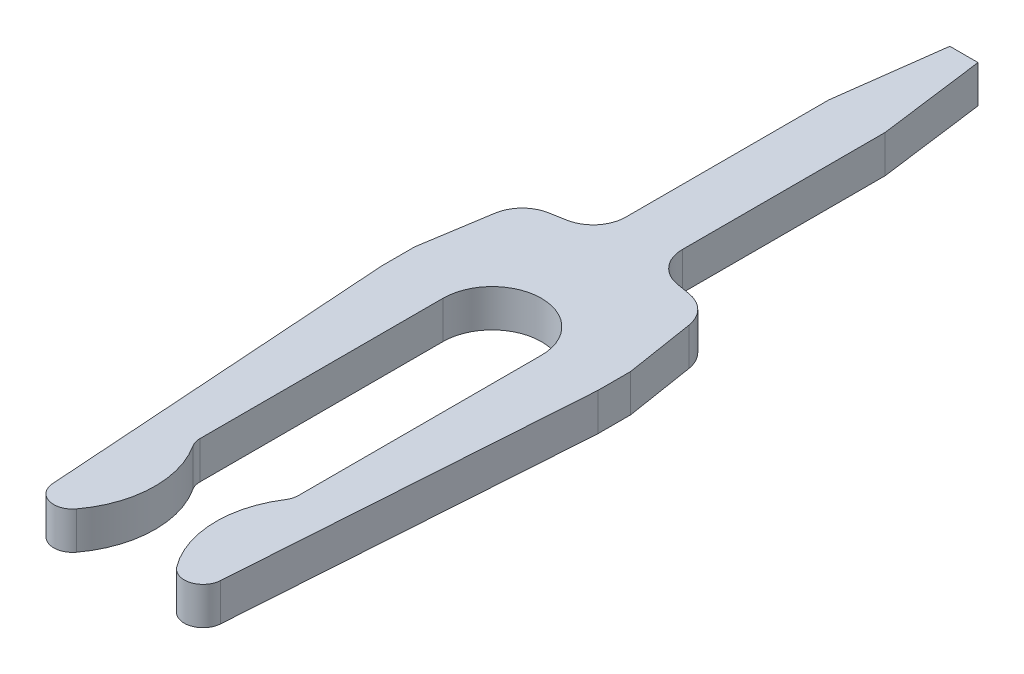
ISO-10303-21;
HEADER;
FILE_DESCRIPTION(('STEP AP214'),'2;1');
FILE_NAME('part.step','',(''),(''),'','','');
FILE_SCHEMA(('AUTOMOTIVE_DESIGN { 1 0 10303 214 1 1 1 1 }'));
ENDSEC;
DATA;
#1=APPLICATION_CONTEXT('core data for automotive mechanical design processes');
#2=APPLICATION_PROTOCOL_DEFINITION('international standard','automotive_design',2000,#1);
#3=PRODUCT_CONTEXT('',#1,'mechanical');
#4=PRODUCT('Part','Part','',(#3));
#5=PRODUCT_RELATED_PRODUCT_CATEGORY('part','',(#4));
#6=PRODUCT_DEFINITION_FORMATION('','',#4);
#7=PRODUCT_DEFINITION_CONTEXT('part definition',#1,'design');
#8=PRODUCT_DEFINITION('design','',#6,#7);
#9=PRODUCT_DEFINITION_SHAPE('','',#8);
#10=(LENGTH_UNIT() NAMED_UNIT(*) SI_UNIT(.MILLI.,.METRE.));
#11=(NAMED_UNIT(*) PLANE_ANGLE_UNIT() SI_UNIT($,.RADIAN.));
#12=(NAMED_UNIT(*) SI_UNIT($,.STERADIAN.) SOLID_ANGLE_UNIT());
#13=UNCERTAINTY_MEASURE_WITH_UNIT(LENGTH_MEASURE(1.E-05),#10,'distance_accuracy_value','');
#14=(GEOMETRIC_REPRESENTATION_CONTEXT(3) GLOBAL_UNCERTAINTY_ASSIGNED_CONTEXT((#13)) GLOBAL_UNIT_ASSIGNED_CONTEXT((#10,
#11,#12)) REPRESENTATION_CONTEXT('',''));
#15=CARTESIAN_POINT('',(0.,0.,0.));
#16=DIRECTION('',(0.,0.,1.));
#17=DIRECTION('',(1.,0.,0.));
#18=AXIS2_PLACEMENT_3D('',#15,#16,#17);
#19=CARTESIAN_POINT('',(1.85247354946435,-0.2,1.01741555409719));
#20=DIRECTION('',(0.,1.,0.));
#21=DIRECTION('',(-0.173648177666931,0.,-0.984807753012208));
#22=AXIS2_PLACEMENT_3D('',#19,#20,#21);
#23=CYLINDRICAL_SURFACE('',#22,0.35);
#24=CARTESIAN_POINT('',(1.85247354946435,-0.2,1.01741555409719));
#25=DIRECTION('',(0.,1.,0.));
#26=DIRECTION('',(-0.173648177666931,0.,-0.984807753012208));
#27=AXIS2_PLACEMENT_3D('',#24,#25,#26);
#28=CIRCLE('',#27,0.35);
#29=CARTESIAN_POINT('',(1.79169668728093,-0.2,0.672732840542913));
#30=VERTEX_POINT('',#29);
#31=CARTESIAN_POINT('',(1.50678263025605,-0.2,0.962663491333105));
#32=VERTEX_POINT('',#31);
#33=EDGE_CURVE('E11',#30,#32,#28,.T.);
#34=ORIENTED_EDGE('',*,*,#33,.T.);
#35=DIRECTION('',(0.,1.,0.));
#36=VECTOR('',#35,1.);
#37=CARTESIAN_POINT('',(1.50678263025605,-0.2,0.962663491333105));
#38=LINE('',#37,#36);
#39=CARTESIAN_POINT('',(1.50678263025605,0.2,0.962663491333105));
#40=VERTEX_POINT('',#39);
#41=EDGE_CURVE('E24',#32,#40,#38,.T.);
#42=ORIENTED_EDGE('',*,*,#41,.T.);
#43=CARTESIAN_POINT('',(1.85247354946435,0.2,1.01741555409719));
#44=DIRECTION('',(0.,1.,0.));
#45=DIRECTION('',(-0.173648177666931,0.,-0.984807753012208));
#46=AXIS2_PLACEMENT_3D('',#43,#44,#45);
#47=CIRCLE('',#46,0.35);
#48=CARTESIAN_POINT('',(1.79169668728093,0.2,0.672732840542913));
#49=VERTEX_POINT('',#48);
#50=EDGE_CURVE('E378',#49,#40,#47,.T.);
#51=ORIENTED_EDGE('',*,*,#50,.F.);
#52=DIRECTION('',(0.,1.,0.));
#53=VECTOR('',#52,1.);
#54=CARTESIAN_POINT('',(1.79169668728093,-0.2,0.672732840542913));
#55=LINE('',#54,#53);
#56=EDGE_CURVE('E210',#30,#49,#55,.T.);
#57=ORIENTED_EDGE('',*,*,#56,.F.);
#58=EDGE_LOOP('',(#34,#42,#51,#57));
#59=FACE_BOUND('',#58,.T.);
#60=ADVANCED_FACE('F17',(#59),#23,.T.);
#61=CARTESIAN_POINT('',(1.50678263025605,-0.2,0.962663491333105));
#62=DIRECTION('',(-0.987688340595138,0.,-0.156434465040231));
#63=DIRECTION('',(-0.156434465040231,0.,0.987688340595138));
#64=AXIS2_PLACEMENT_3D('',#61,#62,#63);
#65=PLANE('',#64);
#66=DIRECTION('',(-0.156434465040231,0.,0.987688340595138));
#67=VECTOR('',#66,1.);
#68=CARTESIAN_POINT('',(1.50678263025605,-0.2,0.962663491333105));
#69=LINE('',#68,#67);
#70=CARTESIAN_POINT('',(1.39,-0.2,1.7));
#71=VERTEX_POINT('',#70);
#72=EDGE_CURVE('E375',#32,#71,#69,.T.);
#73=ORIENTED_EDGE('',*,*,#72,.T.);
#74=DIRECTION('',(0.,1.,0.));
#75=VECTOR('',#74,1.);
#76=CARTESIAN_POINT('',(1.39,-0.2,1.7));
#77=LINE('',#76,#75);
#78=CARTESIAN_POINT('',(1.39,0.2,1.7));
#79=VERTEX_POINT('',#78);
#80=EDGE_CURVE('E373',#71,#79,#77,.T.);
#81=ORIENTED_EDGE('',*,*,#80,.T.);
#82=DIRECTION('',(-0.156434465040231,0.,0.987688340595138));
#83=VECTOR('',#82,1.);
#84=CARTESIAN_POINT('',(1.50678263025605,0.2,0.962663491333105));
#85=LINE('',#84,#83);
#86=EDGE_CURVE('E370',#40,#79,#85,.T.);
#87=ORIENTED_EDGE('',*,*,#86,.F.);
#88=ORIENTED_EDGE('',*,*,#41,.F.);
#89=EDGE_LOOP('',(#73,#81,#87,#88));
#90=FACE_BOUND('',#89,.T.);
#91=ADVANCED_FACE('F382',(#90),#65,.T.);
#92=CARTESIAN_POINT('',(1.39,-0.2,1.7));
#93=DIRECTION('',(-1.,0.,0.));
#94=DIRECTION('',(0.,0.,1.));
#95=AXIS2_PLACEMENT_3D('',#92,#93,#94);
#96=PLANE('',#95);
#97=DIRECTION('',(0.,0.,1.));
#98=VECTOR('',#97,1.);
#99=CARTESIAN_POINT('',(1.39,-0.2,1.7));
#100=LINE('',#99,#98);
#101=CARTESIAN_POINT('',(1.39,-0.2,2.05));
#102=VERTEX_POINT('',#101);
#103=EDGE_CURVE('E368',#71,#102,#100,.T.);
#104=ORIENTED_EDGE('',*,*,#103,.T.);
#105=DIRECTION('',(0.,1.,0.));
#106=VECTOR('',#105,1.);
#107=CARTESIAN_POINT('',(1.39,-0.2,2.05));
#108=LINE('',#107,#106);
#109=CARTESIAN_POINT('',(1.39,0.2,2.05));
#110=VERTEX_POINT('',#109);
#111=EDGE_CURVE('E366',#102,#110,#108,.T.);
#112=ORIENTED_EDGE('',*,*,#111,.T.);
#113=DIRECTION('',(0.,0.,1.));
#114=VECTOR('',#113,1.);
#115=CARTESIAN_POINT('',(1.39,0.2,1.7));
#116=LINE('',#115,#114);
#117=EDGE_CURVE('E363',#79,#110,#116,.T.);
#118=ORIENTED_EDGE('',*,*,#117,.F.);
#119=ORIENTED_EDGE('',*,*,#80,.F.);
#120=EDGE_LOOP('',(#104,#112,#118,#119));
#121=FACE_BOUND('',#120,.T.);
#122=ADVANCED_FACE('F386',(#121),#96,.T.);
#123=CARTESIAN_POINT('',(1.39,-0.2,2.05));
#124=DIRECTION('',(-0.997700667239731,0.,0.0677744685659464));
#125=DIRECTION('',(0.0677744685659464,0.,0.997700667239731));
#126=AXIS2_PLACEMENT_3D('',#123,#124,#125);
#127=PLANE('',#126);
#128=DIRECTION('',(0.0677744685659464,0.,0.997700667239731));
#129=VECTOR('',#128,1.);
#130=CARTESIAN_POINT('',(1.39,-0.2,2.05));
#131=LINE('',#130,#129);
#132=CARTESIAN_POINT('',(1.64566078205187,-0.2,5.81355489371319));
#133=VERTEX_POINT('',#132);
#134=EDGE_CURVE('E361',#102,#133,#131,.T.);
#135=ORIENTED_EDGE('',*,*,#134,.T.);
#136=DIRECTION('',(0.,1.,0.));
#137=VECTOR('',#136,1.);
#138=CARTESIAN_POINT('',(1.64566078205187,-0.2,5.81355489371319));
#139=LINE('',#138,#137);
#140=CARTESIAN_POINT('',(1.64566078205187,0.2,5.81355489371319));
#141=VERTEX_POINT('',#140);
#142=EDGE_CURVE('E359',#133,#141,#139,.T.);
#143=ORIENTED_EDGE('',*,*,#142,.T.);
#144=DIRECTION('',(0.0677744685659464,0.,0.997700667239731));
#145=VECTOR('',#144,1.);
#146=CARTESIAN_POINT('',(1.39,0.2,2.05));
#147=LINE('',#146,#145);
#148=EDGE_CURVE('E356',#110,#141,#147,.T.);
#149=ORIENTED_EDGE('',*,*,#148,.F.);
#150=ORIENTED_EDGE('',*,*,#111,.F.);
#151=EDGE_LOOP('',(#135,#143,#149,#150));
#152=FACE_BOUND('',#151,.T.);
#153=ADVANCED_FACE('F394',(#152),#127,.T.);
#154=CARTESIAN_POINT('',(1.84520091549981,-0.2,5.8));
#155=DIRECTION('',(0.,1.,0.));
#156=DIRECTION('',(-0.99770066723973,0.,0.0677744685659487));
#157=AXIS2_PLACEMENT_3D('',#154,#155,#156);
#158=CYLINDRICAL_SURFACE('',#157,0.2);
#159=CARTESIAN_POINT('',(1.84520091549981,-0.2,5.8));
#160=DIRECTION('',(0.,1.,0.));
#161=DIRECTION('',(-0.99770066723973,0.,0.0677744685659487));
#162=AXIS2_PLACEMENT_3D('',#159,#160,#161);
#163=CIRCLE('',#162,0.2);
#164=CARTESIAN_POINT('',(2.00524818973077,-0.2,5.9199369418121));
#165=VERTEX_POINT('',#164);
#166=EDGE_CURVE('E354',#133,#165,#163,.T.);
#167=ORIENTED_EDGE('',*,*,#166,.T.);
#168=DIRECTION('',(0.,1.,0.));
#169=VECTOR('',#168,1.);
#170=CARTESIAN_POINT('',(2.00524818973077,-0.2,5.9199369418121));
#171=LINE('',#170,#169);
#172=CARTESIAN_POINT('',(2.00524818973077,0.2,5.9199369418121));
#173=VERTEX_POINT('',#172);
#174=EDGE_CURVE('E352',#165,#173,#171,.T.);
#175=ORIENTED_EDGE('',*,*,#174,.T.);
#176=CARTESIAN_POINT('',(1.84520091549981,0.2,5.8));
#177=DIRECTION('',(0.,1.,0.));
#178=DIRECTION('',(-0.99770066723973,0.,0.0677744685659487));
#179=AXIS2_PLACEMENT_3D('',#176,#177,#178);
#180=CIRCLE('',#179,0.2);
#181=EDGE_CURVE('E349',#141,#173,#180,.T.);
#182=ORIENTED_EDGE('',*,*,#181,.F.);
#183=ORIENTED_EDGE('',*,*,#142,.F.);
#184=EDGE_LOOP('',(#167,#175,#182,#183));
#185=FACE_BOUND('',#184,.T.);
#186=ADVANCED_FACE('F398',(#185),#158,.T.);
#187=CARTESIAN_POINT('',(1.16500000001824,-0.2,5.29026799729856));
#188=DIRECTION('',(0.,1.,0.));
#189=DIRECTION('',(0.800236371154797,0.,0.599684709060522));
#190=AXIS2_PLACEMENT_3D('',#187,#188,#189);
#191=CYLINDRICAL_SURFACE('',#190,1.05);
#192=CARTESIAN_POINT('',(1.16500000001824,-0.2,5.29026799729856));
#193=DIRECTION('',(0.,1.,0.));
#194=DIRECTION('',(0.800236371154797,0.,0.599684709060522));
#195=AXIS2_PLACEMENT_3D('',#192,#193,#194);
#196=CIRCLE('',#195,1.05);
#197=CARTESIAN_POINT('',(2.04707348597389,-0.2,4.72066606140469));
#198=VERTEX_POINT('',#197);
#199=EDGE_CURVE('E347',#165,#198,#196,.T.);
#200=ORIENTED_EDGE('',*,*,#199,.T.);
#201=DIRECTION('',(0.,1.,0.));
#202=VECTOR('',#201,1.);
#203=CARTESIAN_POINT('',(2.04707348597389,-0.2,4.72066606140469));
#204=LINE('',#203,#202);
#205=CARTESIAN_POINT('',(2.04707348597389,0.2,4.72066606140469));
#206=VERTEX_POINT('',#205);
#207=EDGE_CURVE('E345',#198,#206,#204,.T.);
#208=ORIENTED_EDGE('',*,*,#207,.T.);
#209=CARTESIAN_POINT('',(1.16500000001824,0.2,5.29026799729856));
#210=DIRECTION('',(0.,1.,0.));
#211=DIRECTION('',(0.800236371154797,0.,0.599684709060522));
#212=AXIS2_PLACEMENT_3D('',#209,#210,#211);
#213=CIRCLE('',#212,1.05);
#214=EDGE_CURVE('E342',#173,#206,#213,.T.);
#215=ORIENTED_EDGE('',*,*,#214,.F.);
#216=ORIENTED_EDGE('',*,*,#174,.F.);
#217=EDGE_LOOP('',(#200,#208,#215,#216));
#218=FACE_BOUND('',#217,.T.);
#219=ADVANCED_FACE('F403',(#218),#191,.T.);
#220=CARTESIAN_POINT('',(2.21508748329877,-0.2,4.61217045456776));
#221=DIRECTION('',(0.,-1.,0.));
#222=DIRECTION('',(-0.84006998662443,0.,0.542478034184639));
#223=AXIS2_PLACEMENT_3D('',#220,#221,#222);
#224=CYLINDRICAL_SURFACE('',#223,0.2);
#225=CARTESIAN_POINT('',(2.21508748329877,-0.2,4.61217045456776));
#226=DIRECTION('',(0.,-1.,0.));
#227=DIRECTION('',(-0.84006998662443,0.,0.542478034184639));
#228=AXIS2_PLACEMENT_3D('',#225,#226,#227);
#229=CIRCLE('',#228,0.2);
#230=CARTESIAN_POINT('',(2.01508748341311,-0.2,4.61217721743755));
#231=VERTEX_POINT('',#230);
#232=EDGE_CURVE('E339',#198,#231,#229,.T.);
#233=ORIENTED_EDGE('',*,*,#232,.T.);
#234=DIRECTION('',(0.,1.,0.));
#235=VECTOR('',#234,1.);
#236=CARTESIAN_POINT('',(2.01508748341311,-0.2,4.61217721743755));
#237=LINE('',#236,#235);
#238=CARTESIAN_POINT('',(2.01508748341311,0.2,4.61217721743755));
#239=VERTEX_POINT('',#238);
#240=EDGE_CURVE('E336',#231,#239,#237,.T.);
#241=ORIENTED_EDGE('',*,*,#240,.T.);
#242=CARTESIAN_POINT('',(2.21508748329877,0.2,4.61217045456776));
#243=DIRECTION('',(0.,-1.,0.));
#244=DIRECTION('',(-0.84006998662443,0.,0.542478034184639));
#245=AXIS2_PLACEMENT_3D('',#242,#243,#244);
#246=CIRCLE('',#245,0.2);
#247=EDGE_CURVE('E334',#206,#239,#246,.T.);
#248=ORIENTED_EDGE('',*,*,#247,.F.);
#249=ORIENTED_EDGE('',*,*,#207,.F.);
#250=EDGE_LOOP('',(#233,#241,#248,#249));
#251=FACE_BOUND('',#250,.T.);
#252=ADVANCED_FACE('F407',(#251),#224,.F.);
#253=CARTESIAN_POINT('',(2.01508748341311,-0.2,4.61217721743755));
#254=DIRECTION('',(0.999999999428295,0.,-3.38143489455719E-05));
#255=DIRECTION('',(-3.38143489455719E-05,0.,-0.999999999428295));
#256=AXIS2_PLACEMENT_3D('',#253,#254,#255);
#257=PLANE('',#256);
#258=DIRECTION('',(-3.38143489456148E-05,0.,-0.999999999428295));
#259=VECTOR('',#258,1.);
#260=CARTESIAN_POINT('',(2.01508748341311,-0.2,4.61217721743755));
#261=LINE('',#260,#259);
#262=CARTESIAN_POINT('',(2.01500000030014,-0.2,2.0250177525332));
#263=VERTEX_POINT('',#262);
#264=EDGE_CURVE('E332',#231,#263,#261,.T.);
#265=ORIENTED_EDGE('',*,*,#264,.T.);
#266=DIRECTION('',(0.,1.,0.));
#267=VECTOR('',#266,1.);
#268=CARTESIAN_POINT('',(2.01500000030014,-0.2,2.0250177525332));
#269=LINE('',#268,#267);
#270=CARTESIAN_POINT('',(2.01500000030014,0.2,2.0250177525332));
#271=VERTEX_POINT('',#270);
#272=EDGE_CURVE('E330',#263,#271,#269,.T.);
#273=ORIENTED_EDGE('',*,*,#272,.T.);
#274=DIRECTION('',(-3.38143489456148E-05,0.,-0.999999999428295));
#275=VECTOR('',#274,1.);
#276=CARTESIAN_POINT('',(2.01508748341311,0.2,4.61217721743755));
#277=LINE('',#276,#275);
#278=EDGE_CURVE('E327',#239,#271,#277,.T.);
#279=ORIENTED_EDGE('',*,*,#278,.F.);
#280=ORIENTED_EDGE('',*,*,#240,.F.);
#281=EDGE_LOOP('',(#265,#273,#279,#280));
#282=FACE_BOUND('',#281,.T.);
#283=ADVANCED_FACE('F413',(#282),#257,.T.);
#284=CARTESIAN_POINT('',(2.53999999999999,-0.2,2.025));
#285=DIRECTION('',(0.,-1.,0.));
#286=DIRECTION('',(-0.999999999428295,0.,3.38143489445978E-05));
#287=AXIS2_PLACEMENT_3D('',#284,#285,#286);
#288=CYLINDRICAL_SURFACE('',#287,0.525);
#289=CARTESIAN_POINT('',(2.53999999999999,-0.2,2.025));
#290=DIRECTION('',(0.,-1.,0.));
#291=DIRECTION('',(-0.999999999428295,0.,3.38143489445978E-05));
#292=AXIS2_PLACEMENT_3D('',#289,#290,#291);
#293=CIRCLE('',#292,0.525);
#294=CARTESIAN_POINT('',(3.06499999969985,-0.2,2.0250177525332));
#295=VERTEX_POINT('',#294);
#296=EDGE_CURVE('E324',#263,#295,#293,.T.);
#297=ORIENTED_EDGE('',*,*,#296,.T.);
#298=DIRECTION('',(0.,1.,0.));
#299=VECTOR('',#298,1.);
#300=CARTESIAN_POINT('',(3.06499999969985,-0.2,2.0250177525332));
#301=LINE('',#300,#299);
#302=CARTESIAN_POINT('',(3.06499999969985,0.2,2.0250177525332));
#303=VERTEX_POINT('',#302);
#304=EDGE_CURVE('E321',#295,#303,#301,.T.);
#305=ORIENTED_EDGE('',*,*,#304,.T.);
#306=CARTESIAN_POINT('',(2.53999999999999,0.2,2.025));
#307=DIRECTION('',(0.,-1.,0.));
#308=DIRECTION('',(-0.999999999428295,0.,3.38143489445978E-05));
#309=AXIS2_PLACEMENT_3D('',#306,#307,#308);
#310=CIRCLE('',#309,0.525);
#311=EDGE_CURVE('E319',#271,#303,#310,.T.);
#312=ORIENTED_EDGE('',*,*,#311,.F.);
#313=ORIENTED_EDGE('',*,*,#272,.F.);
#314=EDGE_LOOP('',(#297,#305,#312,#313));
#315=FACE_BOUND('',#314,.T.);
#316=ADVANCED_FACE('F417',(#315),#288,.F.);
#317=CARTESIAN_POINT('',(3.06499999969985,-0.2,2.0250177525332));
#318=DIRECTION('',(-0.999999999428295,0.,-3.38143489442404E-05));
#319=DIRECTION('',(-3.38143489442404E-05,0.,0.999999999428295));
#320=AXIS2_PLACEMENT_3D('',#317,#318,#319);
#321=PLANE('',#320);
#322=DIRECTION('',(-3.38143489442405E-05,0.,0.999999999428295));
#323=VECTOR('',#322,1.);
#324=CARTESIAN_POINT('',(3.06499999969985,-0.2,2.0250177525332));
#325=LINE('',#324,#323);
#326=CARTESIAN_POINT('',(3.06491251658688,-0.2,4.61217721743764));
#327=VERTEX_POINT('',#326);
#328=EDGE_CURVE('E317',#295,#327,#325,.T.);
#329=ORIENTED_EDGE('',*,*,#328,.T.);
#330=DIRECTION('',(0.,1.,0.));
#331=VECTOR('',#330,1.);
#332=CARTESIAN_POINT('',(3.06491251658688,-0.2,4.61217721743764));
#333=LINE('',#332,#331);
#334=CARTESIAN_POINT('',(3.06491251658688,0.2,4.61217721743764));
#335=VERTEX_POINT('',#334);
#336=EDGE_CURVE('E315',#327,#335,#333,.T.);
#337=ORIENTED_EDGE('',*,*,#336,.T.);
#338=DIRECTION('',(-3.38143489442405E-05,0.,0.999999999428295));
#339=VECTOR('',#338,1.);
#340=CARTESIAN_POINT('',(3.06499999969985,0.2,2.0250177525332));
#341=LINE('',#340,#339);
#342=EDGE_CURVE('E312',#303,#335,#341,.T.);
#343=ORIENTED_EDGE('',*,*,#342,.F.);
#344=ORIENTED_EDGE('',*,*,#304,.F.);
#345=EDGE_LOOP('',(#329,#337,#343,#344));
#346=FACE_BOUND('',#345,.T.);
#347=ADVANCED_FACE('F516',(#346),#321,.T.);
#348=CARTESIAN_POINT('',(2.86491251670122,-0.2,4.61217045456785));
#349=DIRECTION('',(0.,-1.,0.));
#350=DIRECTION('',(0.999999999428295,0.,3.38143489431175E-05));
#351=AXIS2_PLACEMENT_3D('',#348,#349,#350);
#352=CYLINDRICAL_SURFACE('',#351,0.2);
#353=CARTESIAN_POINT('',(2.86491251670122,-0.2,4.61217045456785));
#354=DIRECTION('',(0.,-1.,0.));
#355=DIRECTION('',(0.999999999428295,0.,3.38143489431175E-05));
#356=AXIS2_PLACEMENT_3D('',#353,#354,#355);
#357=CIRCLE('',#356,0.2);
#358=CARTESIAN_POINT('',(3.03292651402611,-0.2,4.72066606140477));
#359=VERTEX_POINT('',#358);
#360=EDGE_CURVE('E309',#327,#359,#357,.T.);
#361=ORIENTED_EDGE('',*,*,#360,.T.);
#362=DIRECTION('',(0.,1.,0.));
#363=VECTOR('',#362,1.);
#364=CARTESIAN_POINT('',(3.03292651402611,-0.2,4.72066606140477));
#365=LINE('',#364,#363);
#366=CARTESIAN_POINT('',(3.03292651402611,0.2,4.72066606140477));
#367=VERTEX_POINT('',#366);
#368=EDGE_CURVE('E306',#359,#367,#365,.T.);
#369=ORIENTED_EDGE('',*,*,#368,.T.);
#370=CARTESIAN_POINT('',(2.86491251670122,0.2,4.61217045456785));
#371=DIRECTION('',(0.,-1.,0.));
#372=DIRECTION('',(0.999999999428295,0.,3.38143489431175E-05));
#373=AXIS2_PLACEMENT_3D('',#370,#371,#372);
#374=CIRCLE('',#373,0.2);
#375=EDGE_CURVE('E304',#335,#367,#374,.T.);
#376=ORIENTED_EDGE('',*,*,#375,.F.);
#377=ORIENTED_EDGE('',*,*,#336,.F.);
#378=EDGE_LOOP('',(#361,#369,#376,#377));
#379=FACE_BOUND('',#378,.T.);
#380=ADVANCED_FACE('F423',(#379),#352,.F.);
#381=CARTESIAN_POINT('',(3.91499999998179,-0.2,5.29026799729859));
#382=DIRECTION('',(0.,1.,0.));
#383=DIRECTION('',(-0.840069986624457,0.,-0.542478034184597));
#384=AXIS2_PLACEMENT_3D('',#381,#382,#383);
#385=CYLINDRICAL_SURFACE('',#384,1.05);
#386=CARTESIAN_POINT('',(3.91499999998179,-0.2,5.29026799729859));
#387=DIRECTION('',(0.,1.,0.));
#388=DIRECTION('',(-0.840069986624457,0.,-0.542478034184597));
#389=AXIS2_PLACEMENT_3D('',#386,#387,#388);
#390=CIRCLE('',#389,1.05);
#391=CARTESIAN_POINT('',(3.07475181026922,-0.2,5.9199369418121));
#392=VERTEX_POINT('',#391);
#393=EDGE_CURVE('E302',#359,#392,#390,.T.);
#394=ORIENTED_EDGE('',*,*,#393,.T.);
#395=DIRECTION('',(0.,1.,0.));
#396=VECTOR('',#395,1.);
#397=CARTESIAN_POINT('',(3.07475181026922,-0.2,5.91993694181209));
#398=LINE('',#397,#396);
#399=CARTESIAN_POINT('',(3.07475181026922,0.2,5.9199369418121));
#400=VERTEX_POINT('',#399);
#401=EDGE_CURVE('E300',#392,#400,#398,.T.);
#402=ORIENTED_EDGE('',*,*,#401,.T.);
#403=CARTESIAN_POINT('',(3.91499999998179,0.2,5.29026799729859));
#404=DIRECTION('',(0.,1.,0.));
#405=DIRECTION('',(-0.840069986624457,0.,-0.542478034184597));
#406=AXIS2_PLACEMENT_3D('',#403,#404,#405);
#407=CIRCLE('',#406,1.05);
#408=EDGE_CURVE('E297',#367,#400,#407,.T.);
#409=ORIENTED_EDGE('',*,*,#408,.F.);
#410=ORIENTED_EDGE('',*,*,#368,.F.);
#411=EDGE_LOOP('',(#394,#402,#409,#410));
#412=FACE_BOUND('',#411,.T.);
#413=ADVANCED_FACE('F428',(#412),#385,.T.);
#414=CARTESIAN_POINT('',(3.23479908450019,-0.2,5.8));
#415=DIRECTION('',(0.,1.,0.));
#416=DIRECTION('',(-0.800236371154828,0.,0.599684709060479));
#417=AXIS2_PLACEMENT_3D('',#414,#415,#416);
#418=CYLINDRICAL_SURFACE('',#417,0.2);
#419=CARTESIAN_POINT('',(3.23479908450019,-0.2,5.8));
#420=DIRECTION('',(0.,1.,0.));
#421=DIRECTION('',(-0.800236371154829,0.,0.599684709060479));
#422=AXIS2_PLACEMENT_3D('',#419,#420,#421);
#423=CIRCLE('',#422,0.2);
#424=CARTESIAN_POINT('',(3.43433921794813,-0.2,5.81355489371319));
#425=VERTEX_POINT('',#424);
#426=EDGE_CURVE('E295',#392,#425,#423,.T.);
#427=ORIENTED_EDGE('',*,*,#426,.T.);
#428=DIRECTION('',(0.,1.,0.));
#429=VECTOR('',#428,1.);
#430=CARTESIAN_POINT('',(3.43433921794813,-0.2,5.81355489371319));
#431=LINE('',#430,#429);
#432=CARTESIAN_POINT('',(3.43433921794813,0.2,5.81355489371319));
#433=VERTEX_POINT('',#432);
#434=EDGE_CURVE('E293',#425,#433,#431,.T.);
#435=ORIENTED_EDGE('',*,*,#434,.T.);
#436=CARTESIAN_POINT('',(3.23479908450019,0.2,5.8));
#437=DIRECTION('',(0.,1.,0.));
#438=DIRECTION('',(-0.800236371154829,0.,0.599684709060479));
#439=AXIS2_PLACEMENT_3D('',#436,#437,#438);
#440=CIRCLE('',#439,0.2);
#441=EDGE_CURVE('E290',#400,#433,#440,.T.);
#442=ORIENTED_EDGE('',*,*,#441,.F.);
#443=ORIENTED_EDGE('',*,*,#401,.F.);
#444=EDGE_LOOP('',(#427,#435,#442,#443));
#445=FACE_BOUND('',#444,.T.);
#446=ADVANCED_FACE('F433',(#445),#418,.T.);
#447=CARTESIAN_POINT('',(3.43433921794813,-0.2,5.81355489371319));
#448=DIRECTION('',(0.997700667239731,0.,0.0677744685659468));
#449=DIRECTION('',(0.0677744685659468,0.,-0.997700667239731));
#450=AXIS2_PLACEMENT_3D('',#447,#448,#449);
#451=PLANE('',#450);
#452=DIRECTION('',(0.0677744685659468,0.,-0.997700667239731));
#453=VECTOR('',#452,1.);
#454=CARTESIAN_POINT('',(3.43433921794813,-0.2,5.81355489371319));
#455=LINE('',#454,#453);
#456=CARTESIAN_POINT('',(3.69,-0.2,2.05));
#457=VERTEX_POINT('',#456);
#458=EDGE_CURVE('E288',#425,#457,#455,.T.);
#459=ORIENTED_EDGE('',*,*,#458,.T.);
#460=DIRECTION('',(0.,1.,0.));
#461=VECTOR('',#460,1.);
#462=CARTESIAN_POINT('',(3.69,-0.2,2.05));
#463=LINE('',#462,#461);
#464=CARTESIAN_POINT('',(3.69,0.2,2.05));
#465=VERTEX_POINT('',#464);
#466=EDGE_CURVE('E286',#457,#465,#463,.T.);
#467=ORIENTED_EDGE('',*,*,#466,.T.);
#468=DIRECTION('',(0.0677744685659468,0.,-0.997700667239731));
#469=VECTOR('',#468,1.);
#470=CARTESIAN_POINT('',(3.43433921794813,0.2,5.81355489371319));
#471=LINE('',#470,#469);
#472=EDGE_CURVE('E283',#433,#465,#471,.T.);
#473=ORIENTED_EDGE('',*,*,#472,.F.);
#474=ORIENTED_EDGE('',*,*,#434,.F.);
#475=EDGE_LOOP('',(#459,#467,#473,#474));
#476=FACE_BOUND('',#475,.T.);
#477=ADVANCED_FACE('F438',(#476),#451,.T.);
#478=CARTESIAN_POINT('',(3.69,-0.2,2.05));
#479=DIRECTION('',(1.,0.,0.));
#480=DIRECTION('',(0.,0.,-1.));
#481=AXIS2_PLACEMENT_3D('',#478,#479,#480);
#482=PLANE('',#481);
#483=DIRECTION('',(0.,0.,-1.));
#484=VECTOR('',#483,1.);
#485=CARTESIAN_POINT('',(3.69,-0.2,2.05));
#486=LINE('',#485,#484);
#487=CARTESIAN_POINT('',(3.69,-0.2,1.7));
#488=VERTEX_POINT('',#487);
#489=EDGE_CURVE('E281',#457,#488,#486,.T.);
#490=ORIENTED_EDGE('',*,*,#489,.T.);
#491=DIRECTION('',(0.,1.,0.));
#492=VECTOR('',#491,1.);
#493=CARTESIAN_POINT('',(3.69,-0.2,1.7));
#494=LINE('',#493,#492);
#495=CARTESIAN_POINT('',(3.69,0.2,1.7));
#496=VERTEX_POINT('',#495);
#497=EDGE_CURVE('E279',#488,#496,#494,.T.);
#498=ORIENTED_EDGE('',*,*,#497,.T.);
#499=DIRECTION('',(0.,0.,-1.));
#500=VECTOR('',#499,1.);
#501=CARTESIAN_POINT('',(3.69,0.2,2.05));
#502=LINE('',#501,#500);
#503=EDGE_CURVE('E276',#465,#496,#502,.T.);
#504=ORIENTED_EDGE('',*,*,#503,.F.);
#505=ORIENTED_EDGE('',*,*,#466,.F.);
#506=EDGE_LOOP('',(#490,#498,#504,#505));
#507=FACE_BOUND('',#506,.T.);
#508=ADVANCED_FACE('F445',(#507),#482,.T.);
#509=CARTESIAN_POINT('',(3.69,-0.2,1.7));
#510=DIRECTION('',(0.987688340595138,0.,-0.156434465040231));
#511=DIRECTION('',(-0.156434465040231,0.,-0.987688340595138));
#512=AXIS2_PLACEMENT_3D('',#509,#510,#511);
#513=PLANE('',#512);
#514=DIRECTION('',(-0.156434465040231,0.,-0.987688340595138));
#515=VECTOR('',#514,1.);
#516=CARTESIAN_POINT('',(3.69,-0.2,1.7));
#517=LINE('',#516,#515);
#518=CARTESIAN_POINT('',(3.57321736974395,-0.2,0.962663491333105));
#519=VERTEX_POINT('',#518);
#520=EDGE_CURVE('E274',#488,#519,#517,.T.);
#521=ORIENTED_EDGE('',*,*,#520,.T.);
#522=DIRECTION('',(0.,1.,0.));
#523=VECTOR('',#522,1.);
#524=CARTESIAN_POINT('',(3.57321736974395,-0.2,0.962663491333105));
#525=LINE('',#524,#523);
#526=CARTESIAN_POINT('',(3.57321736974395,0.2,0.962663491333105));
#527=VERTEX_POINT('',#526);
#528=EDGE_CURVE('E272',#519,#527,#525,.T.);
#529=ORIENTED_EDGE('',*,*,#528,.T.);
#530=DIRECTION('',(-0.156434465040231,0.,-0.987688340595138));
#531=VECTOR('',#530,1.);
#532=CARTESIAN_POINT('',(3.69,0.2,1.7));
#533=LINE('',#532,#531);
#534=EDGE_CURVE('E269',#496,#527,#533,.T.);
#535=ORIENTED_EDGE('',*,*,#534,.F.);
#536=ORIENTED_EDGE('',*,*,#497,.F.);
#537=EDGE_LOOP('',(#521,#529,#535,#536));
#538=FACE_BOUND('',#537,.T.);
#539=ADVANCED_FACE('F449',(#538),#513,.T.);
#540=CARTESIAN_POINT('',(3.22752645053565,-0.2,1.01741555409719));
#541=DIRECTION('',(0.,1.,0.));
#542=DIRECTION('',(0.987688340595138,0.,-0.156434465040231));
#543=AXIS2_PLACEMENT_3D('',#540,#541,#542);
#544=CYLINDRICAL_SURFACE('',#543,0.35);
#545=CARTESIAN_POINT('',(3.22752645053565,-0.2,1.01741555409719));
#546=DIRECTION('',(0.,1.,0.));
#547=DIRECTION('',(0.987688340595138,0.,-0.156434465040231));
#548=AXIS2_PLACEMENT_3D('',#545,#546,#547);
#549=CIRCLE('',#548,0.35);
#550=CARTESIAN_POINT('',(3.28830331271907,-0.2,0.672732840542913));
#551=VERTEX_POINT('',#550);
#552=EDGE_CURVE('E267',#519,#551,#549,.T.);
#553=ORIENTED_EDGE('',*,*,#552,.T.);
#554=DIRECTION('',(0.,1.,0.));
#555=VECTOR('',#554,1.);
#556=CARTESIAN_POINT('',(3.28830331271907,-0.2,0.672732840542913));
#557=LINE('',#556,#555);
#558=CARTESIAN_POINT('',(3.28830331271907,0.2,0.672732840542913));
#559=VERTEX_POINT('',#558);
#560=EDGE_CURVE('E265',#551,#559,#557,.T.);
#561=ORIENTED_EDGE('',*,*,#560,.T.);
#562=CARTESIAN_POINT('',(3.22752645053565,0.2,1.01741555409719));
#563=DIRECTION('',(0.,1.,0.));
#564=DIRECTION('',(0.987688340595138,0.,-0.156434465040231));
#565=AXIS2_PLACEMENT_3D('',#562,#563,#564);
#566=CIRCLE('',#565,0.35);
#567=EDGE_CURVE('E262',#527,#559,#566,.T.);
#568=ORIENTED_EDGE('',*,*,#567,.F.);
#569=ORIENTED_EDGE('',*,*,#528,.F.);
#570=EDGE_LOOP('',(#553,#561,#568,#569));
#571=FACE_BOUND('',#570,.T.);
#572=ADVANCED_FACE('F454',(#571),#544,.T.);
#573=CARTESIAN_POINT('',(3.28830331271907,-0.2,0.672732840542913));
#574=DIRECTION('',(0.173648177666931,0.,-0.984807753012208));
#575=DIRECTION('',(-0.984807753012208,0.,-0.173648177666931));
#576=AXIS2_PLACEMENT_3D('',#573,#574,#575);
#577=PLANE('',#576);
#578=DIRECTION('',(-0.984807753012208,0.,-0.173648177666931));
#579=VECTOR('',#578,1.);
#580=CARTESIAN_POINT('',(3.28830331271907,-0.2,0.672732840542913));
#581=LINE('',#580,#579);
#582=CARTESIAN_POINT('',(3.12922313768045,-0.2,0.64468271353027));
#583=VERTEX_POINT('',#582);
#584=EDGE_CURVE('E260',#551,#583,#581,.T.);
#585=ORIENTED_EDGE('',*,*,#584,.T.);
#586=DIRECTION('',(0.,1.,0.));
#587=VECTOR('',#586,1.);
#588=CARTESIAN_POINT('',(3.12922313767061,-0.2,0.644682713586044));
#589=LINE('',#588,#587);
#590=CARTESIAN_POINT('',(3.12922313768045,0.2,0.64468271353027));
#591=VERTEX_POINT('',#590);
#592=EDGE_CURVE('E258',#583,#591,#589,.T.);
#593=ORIENTED_EDGE('',*,*,#592,.T.);
#594=DIRECTION('',(-0.984807753012208,0.,-0.173648177666931));
#595=VECTOR('',#594,1.);
#596=CARTESIAN_POINT('',(3.28830331271907,0.2,0.672732840542913));
#597=LINE('',#596,#595);
#598=EDGE_CURVE('E255',#559,#591,#597,.T.);
#599=ORIENTED_EDGE('',*,*,#598,.F.);
#600=ORIENTED_EDGE('',*,*,#560,.F.);
#601=EDGE_LOOP('',(#585,#593,#599,#600));
#602=FACE_BOUND('',#601,.T.);
#603=ADVANCED_FACE('F458',(#602),#577,.T.);
#604=CARTESIAN_POINT('',(3.19,-0.2,0.3));
#605=DIRECTION('',(0.,-1.,0.));
#606=DIRECTION('',(-0.173648178055865,0.,0.984807752943628));
#607=AXIS2_PLACEMENT_3D('',#604,#605,#606);
#608=CYLINDRICAL_SURFACE('',#607,0.35);
#609=CARTESIAN_POINT('',(3.19,-0.2,0.3));
#610=DIRECTION('',(0.,-1.,0.));
#611=DIRECTION('',(-0.173648178055865,0.,0.984807752943628));
#612=AXIS2_PLACEMENT_3D('',#609,#610,#611);
#613=CIRCLE('',#612,0.35);
#614=CARTESIAN_POINT('',(2.84,-0.2,0.3));
#615=VERTEX_POINT('',#614);
#616=EDGE_CURVE('E252',#583,#615,#613,.T.);
#617=ORIENTED_EDGE('',*,*,#616,.T.);
#618=DIRECTION('',(0.,1.,0.));
#619=VECTOR('',#618,1.);
#620=CARTESIAN_POINT('',(2.84,-0.2,0.3));
#621=LINE('',#620,#619);
#622=CARTESIAN_POINT('',(2.84,0.2,0.3));
#623=VERTEX_POINT('',#622);
#624=EDGE_CURVE('E249',#615,#623,#621,.T.);
#625=ORIENTED_EDGE('',*,*,#624,.T.);
#626=CARTESIAN_POINT('',(3.19,0.2,0.3));
#627=DIRECTION('',(0.,-1.,0.));
#628=DIRECTION('',(-0.173648178055865,0.,0.984807752943628));
#629=AXIS2_PLACEMENT_3D('',#626,#627,#628);
#630=CIRCLE('',#629,0.35);
#631=EDGE_CURVE('E247',#591,#623,#630,.T.);
#632=ORIENTED_EDGE('',*,*,#631,.F.);
#633=ORIENTED_EDGE('',*,*,#592,.F.);
#634=EDGE_LOOP('',(#617,#625,#632,#633));
#635=FACE_BOUND('',#634,.T.);
#636=ADVANCED_FACE('F464',(#635),#608,.F.);
#637=CARTESIAN_POINT('',(2.84,-0.2,0.3));
#638=DIRECTION('',(1.,0.,0.));
#639=DIRECTION('',(0.,0.,-1.));
#640=AXIS2_PLACEMENT_3D('',#637,#638,#639);
#641=PLANE('',#640);
#642=DIRECTION('',(0.,0.,-1.));
#643=VECTOR('',#642,1.);
#644=CARTESIAN_POINT('',(2.84,-0.2,0.3));
#645=LINE('',#644,#643);
#646=CARTESIAN_POINT('',(2.84,-0.2,-1.86063688309126));
#647=VERTEX_POINT('',#646);
#648=EDGE_CURVE('E245',#615,#647,#645,.T.);
#649=ORIENTED_EDGE('',*,*,#648,.T.);
#650=DIRECTION('',(0.,1.,0.));
#651=VECTOR('',#650,1.);
#652=CARTESIAN_POINT('',(2.84,-0.2,-1.86063688309123));
#653=LINE('',#652,#651);
#654=CARTESIAN_POINT('',(2.84,0.2,-1.86063688309126));
#655=VERTEX_POINT('',#654);
#656=EDGE_CURVE('E243',#647,#655,#653,.T.);
#657=ORIENTED_EDGE('',*,*,#656,.T.);
#658=DIRECTION('',(0.,0.,-1.));
#659=VECTOR('',#658,1.);
#660=CARTESIAN_POINT('',(2.84,0.2,0.3));
#661=LINE('',#660,#659);
#662=EDGE_CURVE('E240',#623,#655,#661,.T.);
#663=ORIENTED_EDGE('',*,*,#662,.F.);
#664=ORIENTED_EDGE('',*,*,#624,.F.);
#665=EDGE_LOOP('',(#649,#657,#663,#664));
#666=FACE_BOUND('',#665,.T.);
#667=ADVANCED_FACE('F537',(#666),#641,.T.);
#668=CARTESIAN_POINT('',(2.84,-0.2,-1.86063688309126));
#669=DIRECTION('',(0.99144486137381,0.,-0.130526192220052));
#670=DIRECTION('',(-0.130526192220052,0.,-0.99144486137381));
#671=AXIS2_PLACEMENT_3D('',#668,#669,#670);
#672=PLANE('',#671);
#673=DIRECTION('',(-0.130526192220052,0.,-0.99144486137381));
#674=VECTOR('',#673,1.);
#675=CARTESIAN_POINT('',(2.84,-0.2,-1.86063688309126));
#676=LINE('',#675,#674);
#677=CARTESIAN_POINT('',(2.69,-0.2,-3.00000000000003));
#678=VERTEX_POINT('',#677);
#679=EDGE_CURVE('E238',#647,#678,#676,.T.);
#680=ORIENTED_EDGE('',*,*,#679,.T.);
#681=DIRECTION('',(0.,1.,0.));
#682=VECTOR('',#681,1.);
#683=CARTESIAN_POINT('',(2.69,-0.2,-3.00000000000003));
#684=LINE('',#683,#682);
#685=CARTESIAN_POINT('',(2.69,0.2,-3.00000000000003));
#686=VERTEX_POINT('',#685);
#687=EDGE_CURVE('E236',#678,#686,#684,.T.);
#688=ORIENTED_EDGE('',*,*,#687,.T.);
#689=DIRECTION('',(-0.130526192220052,0.,-0.99144486137381));
#690=VECTOR('',#689,1.);
#691=CARTESIAN_POINT('',(2.84,0.2,-1.86063688309126));
#692=LINE('',#691,#690);
#693=EDGE_CURVE('E233',#655,#686,#692,.T.);
#694=ORIENTED_EDGE('',*,*,#693,.F.);
#695=ORIENTED_EDGE('',*,*,#656,.F.);
#696=EDGE_LOOP('',(#680,#688,#694,#695));
#697=FACE_BOUND('',#696,.T.);
#698=ADVANCED_FACE('F472',(#697),#672,.T.);
#699=CARTESIAN_POINT('',(2.69,-0.2,-3.00000000000003));
#700=DIRECTION('',(0.,0.,-1.));
#701=DIRECTION('',(-1.,0.,0.));
#702=AXIS2_PLACEMENT_3D('',#699,#700,#701);
#703=PLANE('',#702);
#704=DIRECTION('',(-1.,0.,0.));
#705=VECTOR('',#704,1.);
#706=CARTESIAN_POINT('',(2.69,-0.2,-3.00000000000003));
#707=LINE('',#706,#705);
#708=CARTESIAN_POINT('',(2.39,-0.2,-3.00000000000003));
#709=VERTEX_POINT('',#708);
#710=EDGE_CURVE('E231',#678,#709,#707,.T.);
#711=ORIENTED_EDGE('',*,*,#710,.T.);
#712=DIRECTION('',(0.,1.,0.));
#713=VECTOR('',#712,1.);
#714=CARTESIAN_POINT('',(2.39,-0.2,-3.00000000000003));
#715=LINE('',#714,#713);
#716=CARTESIAN_POINT('',(2.39,0.2,-3.00000000000003));
#717=VERTEX_POINT('',#716);
#718=EDGE_CURVE('E229',#709,#717,#715,.T.);
#719=ORIENTED_EDGE('',*,*,#718,.T.);
#720=DIRECTION('',(-1.,0.,0.));
#721=VECTOR('',#720,1.);
#722=CARTESIAN_POINT('',(2.69,0.2,-3.00000000000003));
#723=LINE('',#722,#721);
#724=EDGE_CURVE('E226',#686,#717,#723,.T.);
#725=ORIENTED_EDGE('',*,*,#724,.F.);
#726=ORIENTED_EDGE('',*,*,#687,.F.);
#727=EDGE_LOOP('',(#711,#719,#725,#726));
#728=FACE_BOUND('',#727,.T.);
#729=ADVANCED_FACE('F476',(#728),#703,.T.);
#730=CARTESIAN_POINT('',(2.39,-0.2,-3.00000000000003));
#731=DIRECTION('',(-0.99144486137381,0.,-0.130526192220052));
#732=DIRECTION('',(-0.130526192220052,0.,0.99144486137381));
#733=AXIS2_PLACEMENT_3D('',#730,#731,#732);
#734=PLANE('',#733);
#735=DIRECTION('',(-0.130526192220052,0.,0.99144486137381));
#736=VECTOR('',#735,1.);
#737=CARTESIAN_POINT('',(2.39,-0.2,-3.00000000000003));
#738=LINE('',#737,#736);
#739=CARTESIAN_POINT('',(2.24,-0.2,-1.86063688309123));
#740=VERTEX_POINT('',#739);
#741=EDGE_CURVE('E224',#709,#740,#738,.T.);
#742=ORIENTED_EDGE('',*,*,#741,.T.);
#743=DIRECTION('',(0.,1.,0.));
#744=VECTOR('',#743,1.);
#745=CARTESIAN_POINT('',(2.24,-0.2,-1.86063688309126));
#746=LINE('',#745,#744);
#747=CARTESIAN_POINT('',(2.24,0.2,-1.86063688309123));
#748=VERTEX_POINT('',#747);
#749=EDGE_CURVE('E222',#740,#748,#746,.T.);
#750=ORIENTED_EDGE('',*,*,#749,.T.);
#751=DIRECTION('',(-0.130526192220052,0.,0.99144486137381));
#752=VECTOR('',#751,1.);
#753=CARTESIAN_POINT('',(2.39,0.2,-3.00000000000003));
#754=LINE('',#753,#752);
#755=EDGE_CURVE('E220',#717,#748,#754,.T.);
#756=ORIENTED_EDGE('',*,*,#755,.F.);
#757=ORIENTED_EDGE('',*,*,#718,.F.);
#758=EDGE_LOOP('',(#742,#750,#756,#757));
#759=FACE_BOUND('',#758,.T.);
#760=ADVANCED_FACE('F482',(#759),#734,.T.);
#761=CARTESIAN_POINT('',(2.24,-0.2,-1.86063688309123));
#762=DIRECTION('',(-1.,0.,0.));
#763=DIRECTION('',(0.,0.,1.));
#764=AXIS2_PLACEMENT_3D('',#761,#762,#763);
#765=PLANE('',#764);
#766=DIRECTION('',(0.,0.,1.));
#767=VECTOR('',#766,1.);
#768=CARTESIAN_POINT('',(2.24,-0.2,-1.86063688309123));
#769=LINE('',#768,#767);
#770=CARTESIAN_POINT('',(2.24,-0.2,0.3));
#771=VERTEX_POINT('',#770);
#772=EDGE_CURVE('E218',#740,#771,#769,.T.);
#773=ORIENTED_EDGE('',*,*,#772,.T.);
#774=DIRECTION('',(0.,1.,0.));
#775=VECTOR('',#774,1.);
#776=CARTESIAN_POINT('',(2.24,-0.2,0.3));
#777=LINE('',#776,#775);
#778=CARTESIAN_POINT('',(2.24,0.2,0.3));
#779=VERTEX_POINT('',#778);
#780=EDGE_CURVE('E216',#771,#779,#777,.T.);
#781=ORIENTED_EDGE('',*,*,#780,.T.);
#782=DIRECTION('',(0.,0.,1.));
#783=VECTOR('',#782,1.);
#784=CARTESIAN_POINT('',(2.24,0.2,-1.86063688309123));
#785=LINE('',#784,#783);
#786=EDGE_CURVE('E195',#748,#779,#785,.T.);
#787=ORIENTED_EDGE('',*,*,#786,.F.);
#788=ORIENTED_EDGE('',*,*,#749,.F.);
#789=EDGE_LOOP('',(#773,#781,#787,#788));
#790=FACE_BOUND('',#789,.T.);
#791=ADVANCED_FACE('F485',(#790),#765,.T.);
#792=CARTESIAN_POINT('',(1.89,-0.2,0.3));
#793=DIRECTION('',(0.,-1.,0.));
#794=DIRECTION('',(1.,0.,0.));
#795=AXIS2_PLACEMENT_3D('',#792,#793,#794);
#796=CYLINDRICAL_SURFACE('',#795,0.35);
#797=CARTESIAN_POINT('',(1.89,-0.2,0.3));
#798=DIRECTION('',(0.,-1.,0.));
#799=DIRECTION('',(1.,0.,0.));
#800=AXIS2_PLACEMENT_3D('',#797,#798,#799);
#801=CIRCLE('',#800,0.35);
#802=CARTESIAN_POINT('',(1.95077686232939,-0.2,0.644682713586044));
#803=VERTEX_POINT('',#802);
#804=EDGE_CURVE('E204',#771,#803,#801,.T.);
#805=ORIENTED_EDGE('',*,*,#804,.T.);
#806=DIRECTION('',(0.,1.,0.));
#807=VECTOR('',#806,1.);
#808=CARTESIAN_POINT('',(1.95077686232939,-0.2,0.644682713586044));
#809=LINE('',#808,#807);
#810=CARTESIAN_POINT('',(1.95077686232939,0.2,0.644682713586044));
#811=VERTEX_POINT('',#810);
#812=EDGE_CURVE('E198',#803,#811,#809,.T.);
#813=ORIENTED_EDGE('',*,*,#812,.T.);
#814=CARTESIAN_POINT('',(1.89,0.2,0.3));
#815=DIRECTION('',(0.,-1.,0.));
#816=DIRECTION('',(1.,0.,0.));
#817=AXIS2_PLACEMENT_3D('',#814,#815,#816);
#818=CIRCLE('',#817,0.35);
#819=EDGE_CURVE('E187',#779,#811,#818,.T.);
#820=ORIENTED_EDGE('',*,*,#819,.F.);
#821=ORIENTED_EDGE('',*,*,#780,.F.);
#822=EDGE_LOOP('',(#805,#813,#820,#821));
#823=FACE_BOUND('',#822,.T.);
#824=ADVANCED_FACE('F202',(#823),#796,.F.);
#825=CARTESIAN_POINT('',(1.95077686232939,-0.2,0.644682713586044));
#826=DIRECTION('',(-0.17364817766693,0.,-0.984807753012208));
#827=DIRECTION('',(-0.984807753012208,0.,0.17364817766693));
#828=AXIS2_PLACEMENT_3D('',#825,#826,#827);
#829=PLANE('',#828);
#830=DIRECTION('',(-0.984807753012208,0.,0.17364817766693));
#831=VECTOR('',#830,1.);
#832=CARTESIAN_POINT('',(1.95077686232939,-0.2,0.644682713586044));
#833=LINE('',#832,#831);
#834=EDGE_CURVE('E199',#803,#30,#833,.T.);
#835=ORIENTED_EDGE('',*,*,#834,.T.);
#836=ORIENTED_EDGE('',*,*,#56,.T.);
#837=DIRECTION('',(-0.984807753012208,0.,0.17364817766693));
#838=VECTOR('',#837,1.);
#839=CARTESIAN_POINT('',(1.95077686232939,0.2,0.644682713586044));
#840=LINE('',#839,#838);
#841=EDGE_CURVE('E192',#811,#49,#840,.T.);
#842=ORIENTED_EDGE('',*,*,#841,.F.);
#843=ORIENTED_EDGE('',*,*,#812,.F.);
#844=EDGE_LOOP('',(#835,#836,#842,#843));
#845=FACE_BOUND('',#844,.T.);
#846=ADVANCED_FACE('F209',(#845),#829,.T.);
#847=CARTESIAN_POINT('',(2.54,0.2,0.));
#848=DIRECTION('',(0.,1.,0.));
#849=DIRECTION('',(1.,0.,0.));
#850=AXIS2_PLACEMENT_3D('',#847,#848,#849);
#851=PLANE('',#850);
#852=ORIENTED_EDGE('',*,*,#50,.T.);
#853=ORIENTED_EDGE('',*,*,#86,.T.);
#854=ORIENTED_EDGE('',*,*,#117,.T.);
#855=ORIENTED_EDGE('',*,*,#148,.T.);
#856=ORIENTED_EDGE('',*,*,#181,.T.);
#857=ORIENTED_EDGE('',*,*,#214,.T.);
#858=ORIENTED_EDGE('',*,*,#247,.T.);
#859=ORIENTED_EDGE('',*,*,#278,.T.);
#860=ORIENTED_EDGE('',*,*,#311,.T.);
#861=ORIENTED_EDGE('',*,*,#342,.T.);
#862=ORIENTED_EDGE('',*,*,#375,.T.);
#863=ORIENTED_EDGE('',*,*,#408,.T.);
#864=ORIENTED_EDGE('',*,*,#441,.T.);
#865=ORIENTED_EDGE('',*,*,#472,.T.);
#866=ORIENTED_EDGE('',*,*,#503,.T.);
#867=ORIENTED_EDGE('',*,*,#534,.T.);
#868=ORIENTED_EDGE('',*,*,#567,.T.);
#869=ORIENTED_EDGE('',*,*,#598,.T.);
#870=ORIENTED_EDGE('',*,*,#631,.T.);
#871=ORIENTED_EDGE('',*,*,#662,.T.);
#872=ORIENTED_EDGE('',*,*,#693,.T.);
#873=ORIENTED_EDGE('',*,*,#724,.T.);
#874=ORIENTED_EDGE('',*,*,#755,.T.);
#875=ORIENTED_EDGE('',*,*,#786,.T.);
#876=ORIENTED_EDGE('',*,*,#819,.T.);
#877=ORIENTED_EDGE('',*,*,#841,.T.);
#878=EDGE_LOOP('',(#852,#853,#854,#855,#856,#857,#858,#859,#860,#861,#862,#863,#864,#865,#866,
#867,#868,#869,#870,#871,#872,#873,#874,#875,#876,#877));
#879=FACE_BOUND('',#878,.T.);
#880=ADVANCED_FACE('F190',(#879),#851,.T.);
#881=CARTESIAN_POINT('',(2.54,-0.2,0.));
#882=DIRECTION('',(0.,1.,0.));
#883=DIRECTION('',(1.,0.,0.));
#884=AXIS2_PLACEMENT_3D('',#881,#882,#883);
#885=PLANE('',#884);
#886=ORIENTED_EDGE('',*,*,#834,.F.);
#887=ORIENTED_EDGE('',*,*,#804,.F.);
#888=ORIENTED_EDGE('',*,*,#772,.F.);
#889=ORIENTED_EDGE('',*,*,#741,.F.);
#890=ORIENTED_EDGE('',*,*,#710,.F.);
#891=ORIENTED_EDGE('',*,*,#679,.F.);
#892=ORIENTED_EDGE('',*,*,#648,.F.);
#893=ORIENTED_EDGE('',*,*,#616,.F.);
#894=ORIENTED_EDGE('',*,*,#584,.F.);
#895=ORIENTED_EDGE('',*,*,#552,.F.);
#896=ORIENTED_EDGE('',*,*,#520,.F.);
#897=ORIENTED_EDGE('',*,*,#489,.F.);
#898=ORIENTED_EDGE('',*,*,#458,.F.);
#899=ORIENTED_EDGE('',*,*,#426,.F.);
#900=ORIENTED_EDGE('',*,*,#393,.F.);
#901=ORIENTED_EDGE('',*,*,#360,.F.);
#902=ORIENTED_EDGE('',*,*,#328,.F.);
#903=ORIENTED_EDGE('',*,*,#296,.F.);
#904=ORIENTED_EDGE('',*,*,#264,.F.);
#905=ORIENTED_EDGE('',*,*,#232,.F.);
#906=ORIENTED_EDGE('',*,*,#199,.F.);
#907=ORIENTED_EDGE('',*,*,#166,.F.);
#908=ORIENTED_EDGE('',*,*,#134,.F.);
#909=ORIENTED_EDGE('',*,*,#103,.F.);
#910=ORIENTED_EDGE('',*,*,#72,.F.);
#911=ORIENTED_EDGE('',*,*,#33,.F.);
#912=EDGE_LOOP('',(#886,#887,#888,#889,#890,#891,#892,#893,#894,#895,#896,#897,#898,#899,#900,
#901,#902,#903,#904,#905,#906,#907,#908,#909,#910,#911));
#913=FACE_BOUND('',#912,.T.);
#914=ADVANCED_FACE('F389',(#913),#885,.F.);
#915=CLOSED_SHELL('',(#60,#91,#122,#153,#186,#219,#252,#283,#316,#347,#380,#413,#446,#477,#508,
#539,#572,#603,#636,#667,#698,#729,#760,#791,#824,#846,#880,#914));
#916=MANIFOLD_SOLID_BREP('B1',#915);
#917=ADVANCED_BREP_SHAPE_REPRESENTATION('',(#18,#916),#14);
#918=SHAPE_DEFINITION_REPRESENTATION(#9,#917);
ENDSEC;
END-ISO-10303-21;
